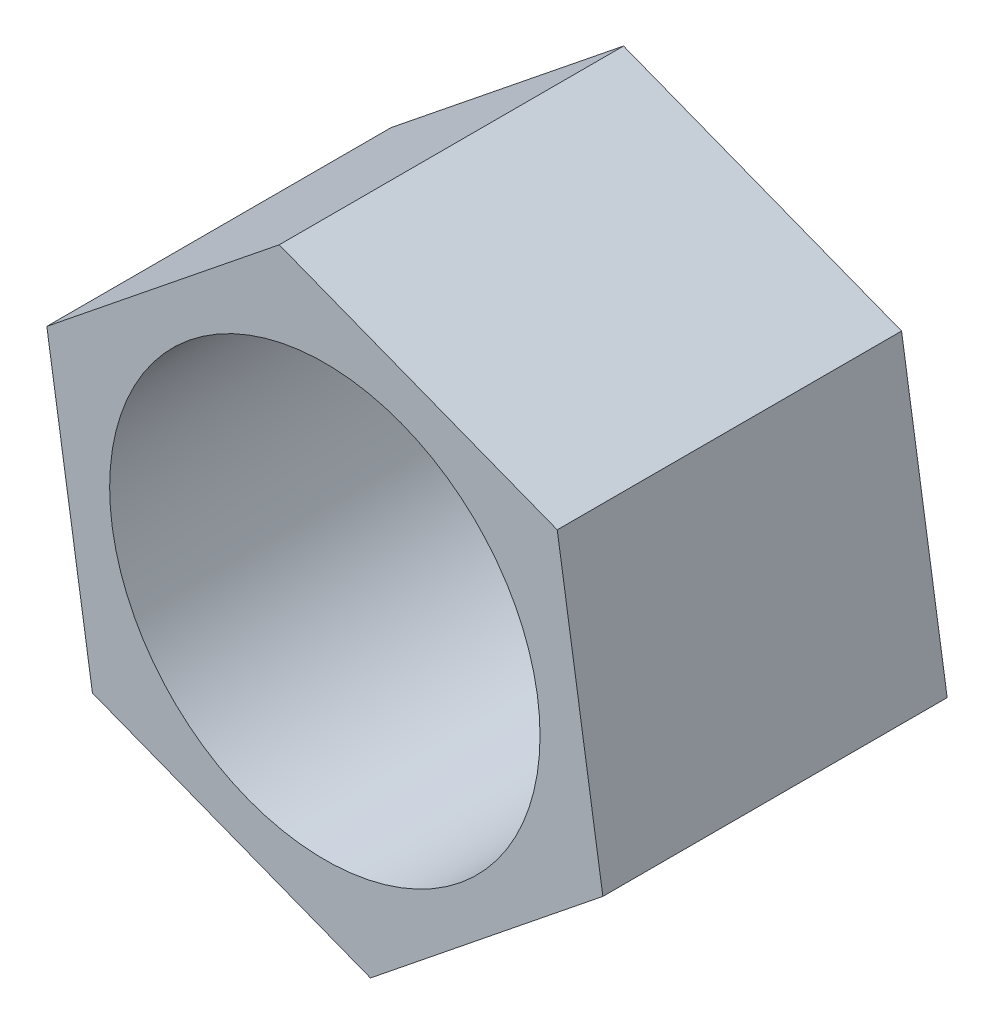
ISO-10303-21;
HEADER;
FILE_DESCRIPTION(('STEP AP214'),'2;1');
FILE_NAME('part.step','',(''),(''),'','','');
FILE_SCHEMA(('AUTOMOTIVE_DESIGN { 1 0 10303 214 1 1 1 1 }'));
ENDSEC;
DATA;
#1=APPLICATION_CONTEXT('core data for automotive mechanical design processes');
#2=APPLICATION_PROTOCOL_DEFINITION('international standard','automotive_design',2000,#1);
#3=PRODUCT_CONTEXT('',#1,'mechanical');
#4=PRODUCT('Part','Part','',(#3));
#5=PRODUCT_RELATED_PRODUCT_CATEGORY('part','',(#4));
#6=PRODUCT_DEFINITION_FORMATION('','',#4);
#7=PRODUCT_DEFINITION_CONTEXT('part definition',#1,'design');
#8=PRODUCT_DEFINITION('design','',#6,#7);
#9=PRODUCT_DEFINITION_SHAPE('','',#8);
#10=(LENGTH_UNIT() NAMED_UNIT(*) SI_UNIT(.MILLI.,.METRE.));
#11=(NAMED_UNIT(*) PLANE_ANGLE_UNIT() SI_UNIT($,.RADIAN.));
#12=(NAMED_UNIT(*) SI_UNIT($,.STERADIAN.) SOLID_ANGLE_UNIT());
#13=UNCERTAINTY_MEASURE_WITH_UNIT(LENGTH_MEASURE(1.E-05),#10,'distance_accuracy_value','');
#14=(GEOMETRIC_REPRESENTATION_CONTEXT(3) GLOBAL_UNCERTAINTY_ASSIGNED_CONTEXT((#13)) GLOBAL_UNIT_ASSIGNED_CONTEXT((#10,
#11,#12)) REPRESENTATION_CONTEXT('',''));
#15=CARTESIAN_POINT('',(0.,0.,0.));
#16=DIRECTION('',(0.,0.,1.));
#17=DIRECTION('',(1.,0.,0.));
#18=AXIS2_PLACEMENT_3D('',#15,#16,#17);
#19=CARTESIAN_POINT('',(0.,0.,4.));
#20=DIRECTION('',(0.,0.,1.));
#21=DIRECTION('',(1.,0.,0.));
#22=AXIS2_PLACEMENT_3D('',#19,#20,#21);
#23=PLANE('',#22);
#24=DIRECTION('',(-0.932308653840993,0.361663619919389,0.));
#25=VECTOR('',#24,1.);
#26=CARTESIAN_POINT('',(2.69979681654691,2.17050619657332,4.));
#27=LINE('',#26,#25);
#28=CARTESIAN_POINT('',(2.69979681654691,2.17050619657332,4.));
#29=VERTEX_POINT('',#28);
#30=CARTESIAN_POINT('',(-0.529815097030577,3.42334572647264,4.));
#31=VERTEX_POINT('',#30);
#32=EDGE_CURVE('E128',#29,#31,#27,.T.);
#33=ORIENTED_EDGE('',*,*,#32,.T.);
#34=DIRECTION('',(-0.779364209395327,-0.626571168434678,0.));
#35=VECTOR('',#34,1.);
#36=CARTESIAN_POINT('',(-0.529815097030577,3.42334572647264,4.));
#37=LINE('',#36,#35);
#38=CARTESIAN_POINT('',(-3.22961191357749,1.25283952989932,4.));
#39=VERTEX_POINT('',#38);
#40=EDGE_CURVE('E86',#31,#39,#37,.T.);
#41=ORIENTED_EDGE('',*,*,#40,.T.);
#42=DIRECTION('',(0.152944444445666,-0.988234788354067,0.));
#43=VECTOR('',#42,1.);
#44=CARTESIAN_POINT('',(-3.22961191357749,1.25283952989932,4.));
#45=LINE('',#44,#43);
#46=CARTESIAN_POINT('',(-2.69979681654691,-2.17050619657332,4.));
#47=VERTEX_POINT('',#46);
#48=EDGE_CURVE('E99',#39,#47,#45,.T.);
#49=ORIENTED_EDGE('',*,*,#48,.T.);
#50=DIRECTION('',(0.932308653840993,-0.361663619919389,0.));
#51=VECTOR('',#50,1.);
#52=CARTESIAN_POINT('',(-2.69979681654691,-2.17050619657332,4.));
#53=LINE('',#52,#51);
#54=CARTESIAN_POINT('',(0.529815097030579,-3.42334572647264,4.));
#55=VERTEX_POINT('',#54);
#56=EDGE_CURVE('E93',#47,#55,#53,.T.);
#57=ORIENTED_EDGE('',*,*,#56,.T.);
#58=DIRECTION('',(0.779364209395327,0.626571168434678,0.));
#59=VECTOR('',#58,1.);
#60=CARTESIAN_POINT('',(0.529815097030579,-3.42334572647264,4.));
#61=LINE('',#60,#59);
#62=CARTESIAN_POINT('',(3.22961191357749,-1.25283952989932,4.));
#63=VERTEX_POINT('',#62);
#64=EDGE_CURVE('E97',#55,#63,#61,.T.);
#65=ORIENTED_EDGE('',*,*,#64,.T.);
#66=DIRECTION('',(-0.152944444445666,0.988234788354067,0.));
#67=VECTOR('',#66,1.);
#68=CARTESIAN_POINT('',(3.22961191357749,-1.25283952989932,4.));
#69=LINE('',#68,#67);
#70=EDGE_CURVE('E49',#63,#29,#69,.T.);
#71=ORIENTED_EDGE('',*,*,#70,.T.);
#72=EDGE_LOOP('',(#33,#41,#49,#57,#65,#71));
#73=FACE_BOUND('',#72,.T.);
#74=CARTESIAN_POINT('',(0.,0.,4.));
#75=DIRECTION('',(0.,0.,1.));
#76=DIRECTION('',(1.,0.,0.));
#77=AXIS2_PLACEMENT_3D('',#74,#75,#76);
#78=CIRCLE('',#77,2.5);
#79=CARTESIAN_POINT('',(2.5,0.,4.));
#80=VERTEX_POINT('',#79);
#81=EDGE_CURVE('E121',#80,#80,#78,.T.);
#82=ORIENTED_EDGE('',*,*,#81,.F.);
#83=EDGE_LOOP('',(#82));
#84=FACE_BOUND('',#83,.T.);
#85=ADVANCED_FACE('F32',(#73,#84),#23,.T.);
#86=CARTESIAN_POINT('',(0.,0.,0.));
#87=DIRECTION('',(0.,0.,1.));
#88=DIRECTION('',(1.,0.,0.));
#89=AXIS2_PLACEMENT_3D('',#86,#87,#88);
#90=PLANE('',#89);
#91=DIRECTION('',(-0.932308653840993,0.361663619919389,0.));
#92=VECTOR('',#91,1.);
#93=CARTESIAN_POINT('',(2.69979681654691,2.17050619657332,0.));
#94=LINE('',#93,#92);
#95=CARTESIAN_POINT('',(2.69979681654691,2.17050619657332,0.));
#96=VERTEX_POINT('',#95);
#97=CARTESIAN_POINT('',(-0.529815097030577,3.42334572647264,0.));
#98=VERTEX_POINT('',#97);
#99=EDGE_CURVE('E117',#96,#98,#94,.T.);
#100=ORIENTED_EDGE('',*,*,#99,.F.);
#101=DIRECTION('',(-0.152944444445666,0.988234788354067,0.));
#102=VECTOR('',#101,1.);
#103=CARTESIAN_POINT('',(3.22961191357749,-1.25283952989932,0.));
#104=LINE('',#103,#102);
#105=CARTESIAN_POINT('',(3.22961191357749,-1.25283952989932,0.));
#106=VERTEX_POINT('',#105);
#107=EDGE_CURVE('E78',#106,#96,#104,.T.);
#108=ORIENTED_EDGE('',*,*,#107,.F.);
#109=DIRECTION('',(0.779364209395327,0.626571168434678,0.));
#110=VECTOR('',#109,1.);
#111=CARTESIAN_POINT('',(0.529815097030579,-3.42334572647264,0.));
#112=LINE('',#111,#110);
#113=CARTESIAN_POINT('',(0.529815097030579,-3.42334572647264,0.));
#114=VERTEX_POINT('',#113);
#115=EDGE_CURVE('E72',#114,#106,#112,.T.);
#116=ORIENTED_EDGE('',*,*,#115,.F.);
#117=DIRECTION('',(0.932308653840993,-0.361663619919389,0.));
#118=VECTOR('',#117,1.);
#119=CARTESIAN_POINT('',(-2.69979681654691,-2.17050619657332,0.));
#120=LINE('',#119,#118);
#121=CARTESIAN_POINT('',(-2.69979681654691,-2.17050619657332,0.));
#122=VERTEX_POINT('',#121);
#123=EDGE_CURVE('E107',#122,#114,#120,.T.);
#124=ORIENTED_EDGE('',*,*,#123,.F.);
#125=DIRECTION('',(0.152944444445666,-0.988234788354067,0.));
#126=VECTOR('',#125,1.);
#127=CARTESIAN_POINT('',(-3.22961191357749,1.25283952989932,0.));
#128=LINE('',#127,#126);
#129=CARTESIAN_POINT('',(-3.22961191357749,1.25283952989932,0.));
#130=VERTEX_POINT('',#129);
#131=EDGE_CURVE('E123',#130,#122,#128,.T.);
#132=ORIENTED_EDGE('',*,*,#131,.F.);
#133=DIRECTION('',(-0.779364209395327,-0.626571168434678,0.));
#134=VECTOR('',#133,1.);
#135=CARTESIAN_POINT('',(-0.529815097030577,3.42334572647264,0.));
#136=LINE('',#135,#134);
#137=EDGE_CURVE('E120',#98,#130,#136,.T.);
#138=ORIENTED_EDGE('',*,*,#137,.F.);
#139=EDGE_LOOP('',(#100,#108,#116,#124,#132,#138));
#140=FACE_BOUND('',#139,.T.);
#141=CARTESIAN_POINT('',(0.,0.,0.));
#142=DIRECTION('',(0.,0.,1.));
#143=DIRECTION('',(1.,0.,0.));
#144=AXIS2_PLACEMENT_3D('',#141,#142,#143);
#145=CIRCLE('',#144,2.5);
#146=CARTESIAN_POINT('',(2.5,0.,0.));
#147=VERTEX_POINT('',#146);
#148=EDGE_CURVE('E221',#147,#147,#145,.T.);
#149=ORIENTED_EDGE('',*,*,#148,.T.);
#150=EDGE_LOOP('',(#149));
#151=FACE_BOUND('',#150,.T.);
#152=ADVANCED_FACE('F137',(#140,#151),#90,.F.);
#153=CARTESIAN_POINT('',(2.69979681654691,2.17050619657332,4.));
#154=DIRECTION('',(-0.361663619919389,-0.932308653840993,0.));
#155=DIRECTION('',(0.932308653840993,-0.361663619919389,0.));
#156=AXIS2_PLACEMENT_3D('',#153,#154,#155);
#157=PLANE('',#156);
#158=ORIENTED_EDGE('',*,*,#99,.T.);
#159=DIRECTION('',(0.,0.,-1.));
#160=VECTOR('',#159,1.);
#161=CARTESIAN_POINT('',(-0.529815097030577,3.42334572647264,4.));
#162=LINE('',#161,#160);
#163=EDGE_CURVE('E11',#31,#98,#162,.T.);
#164=ORIENTED_EDGE('',*,*,#163,.F.);
#165=ORIENTED_EDGE('',*,*,#32,.F.);
#166=DIRECTION('',(0.,0.,-1.));
#167=VECTOR('',#166,1.);
#168=CARTESIAN_POINT('',(2.69979681654691,2.17050619657332,4.));
#169=LINE('',#168,#167);
#170=EDGE_CURVE('E113',#29,#96,#169,.T.);
#171=ORIENTED_EDGE('',*,*,#170,.T.);
#172=EDGE_LOOP('',(#158,#164,#165,#171));
#173=FACE_BOUND('',#172,.T.);
#174=ADVANCED_FACE('F34',(#173),#157,.F.);
#175=CARTESIAN_POINT('',(-0.529815097030577,3.42334572647264,4.));
#176=DIRECTION('',(0.626571168434678,-0.779364209395327,0.));
#177=DIRECTION('',(0.779364209395327,0.626571168434678,0.));
#178=AXIS2_PLACEMENT_3D('',#175,#176,#177);
#179=PLANE('',#178);
#180=ORIENTED_EDGE('',*,*,#137,.T.);
#181=DIRECTION('',(0.,0.,-1.));
#182=VECTOR('',#181,1.);
#183=CARTESIAN_POINT('',(-3.22961191357749,1.25283952989932,4.));
#184=LINE('',#183,#182);
#185=EDGE_CURVE('E41',#39,#130,#184,.T.);
#186=ORIENTED_EDGE('',*,*,#185,.F.);
#187=ORIENTED_EDGE('',*,*,#40,.F.);
#188=ORIENTED_EDGE('',*,*,#163,.T.);
#189=EDGE_LOOP('',(#180,#186,#187,#188));
#190=FACE_BOUND('',#189,.T.);
#191=ADVANCED_FACE('F162',(#190),#179,.F.);
#192=CARTESIAN_POINT('',(-3.22961191357749,1.25283952989932,4.));
#193=DIRECTION('',(0.988234788354066,0.152944444445666,0.));
#194=DIRECTION('',(-0.152944444445666,0.988234788354067,0.));
#195=AXIS2_PLACEMENT_3D('',#192,#193,#194);
#196=PLANE('',#195);
#197=ORIENTED_EDGE('',*,*,#131,.T.);
#198=DIRECTION('',(0.,0.,-1.));
#199=VECTOR('',#198,1.);
#200=CARTESIAN_POINT('',(-2.69979681654691,-2.17050619657332,4.));
#201=LINE('',#200,#199);
#202=EDGE_CURVE('E108',#47,#122,#201,.T.);
#203=ORIENTED_EDGE('',*,*,#202,.F.);
#204=ORIENTED_EDGE('',*,*,#48,.F.);
#205=ORIENTED_EDGE('',*,*,#185,.T.);
#206=EDGE_LOOP('',(#197,#203,#204,#205));
#207=FACE_BOUND('',#206,.T.);
#208=ADVANCED_FACE('F134',(#207),#196,.F.);
#209=CARTESIAN_POINT('',(-2.69979681654691,-2.17050619657332,4.));
#210=DIRECTION('',(0.361663619919389,0.932308653840993,0.));
#211=DIRECTION('',(-0.932308653840993,0.361663619919389,0.));
#212=AXIS2_PLACEMENT_3D('',#209,#210,#211);
#213=PLANE('',#212);
#214=ORIENTED_EDGE('',*,*,#123,.T.);
#215=DIRECTION('',(0.,0.,-1.));
#216=VECTOR('',#215,1.);
#217=CARTESIAN_POINT('',(0.529815097030579,-3.42334572647264,4.));
#218=LINE('',#217,#216);
#219=EDGE_CURVE('E104',#55,#114,#218,.T.);
#220=ORIENTED_EDGE('',*,*,#219,.F.);
#221=ORIENTED_EDGE('',*,*,#56,.F.);
#222=ORIENTED_EDGE('',*,*,#202,.T.);
#223=EDGE_LOOP('',(#214,#220,#221,#222));
#224=FACE_BOUND('',#223,.T.);
#225=ADVANCED_FACE('F105',(#224),#213,.F.);
#226=CARTESIAN_POINT('',(0.529815097030579,-3.42334572647264,4.));
#227=DIRECTION('',(-0.626571168434678,0.779364209395327,0.));
#228=DIRECTION('',(-0.779364209395327,-0.626571168434678,0.));
#229=AXIS2_PLACEMENT_3D('',#226,#227,#228);
#230=PLANE('',#229);
#231=ORIENTED_EDGE('',*,*,#115,.T.);
#232=DIRECTION('',(0.,0.,-1.));
#233=VECTOR('',#232,1.);
#234=CARTESIAN_POINT('',(3.22961191357749,-1.25283952989932,4.));
#235=LINE('',#234,#233);
#236=EDGE_CURVE('E109',#63,#106,#235,.T.);
#237=ORIENTED_EDGE('',*,*,#236,.F.);
#238=ORIENTED_EDGE('',*,*,#64,.F.);
#239=ORIENTED_EDGE('',*,*,#219,.T.);
#240=EDGE_LOOP('',(#231,#237,#238,#239));
#241=FACE_BOUND('',#240,.T.);
#242=ADVANCED_FACE('F111',(#241),#230,.F.);
#243=CARTESIAN_POINT('',(3.22961191357749,-1.25283952989932,4.));
#244=DIRECTION('',(-0.988234788354067,-0.152944444445666,0.));
#245=DIRECTION('',(0.152944444445666,-0.988234788354067,0.));
#246=AXIS2_PLACEMENT_3D('',#243,#244,#245);
#247=PLANE('',#246);
#248=ORIENTED_EDGE('',*,*,#107,.T.);
#249=ORIENTED_EDGE('',*,*,#170,.F.);
#250=ORIENTED_EDGE('',*,*,#70,.F.);
#251=ORIENTED_EDGE('',*,*,#236,.T.);
#252=EDGE_LOOP('',(#248,#249,#250,#251));
#253=FACE_BOUND('',#252,.T.);
#254=ADVANCED_FACE('F142',(#253),#247,.F.);
#255=CARTESIAN_POINT('',(0.,0.,4.));
#256=DIRECTION('',(0.,0.,-1.));
#257=DIRECTION('',(-1.,0.,0.));
#258=AXIS2_PLACEMENT_3D('',#255,#256,#257);
#259=CYLINDRICAL_SURFACE('',#258,2.5);
#260=ORIENTED_EDGE('',*,*,#81,.T.);
#261=EDGE_LOOP('',(#260));
#262=FACE_BOUND('',#261,.T.);
#263=ORIENTED_EDGE('',*,*,#148,.F.);
#264=EDGE_LOOP('',(#263));
#265=FACE_BOUND('',#264,.T.);
#266=ADVANCED_FACE('F144',(#262,#265),#259,.F.);
#267=CLOSED_SHELL('',(#85,#152,#174,#191,#208,#225,#242,#254,#266));
#268=MANIFOLD_SOLID_BREP('B2',#267);
#269=ADVANCED_BREP_SHAPE_REPRESENTATION('',(#18,#268),#14);
#270=SHAPE_DEFINITION_REPRESENTATION(#9,#269);
ENDSEC;
END-ISO-10303-21;
